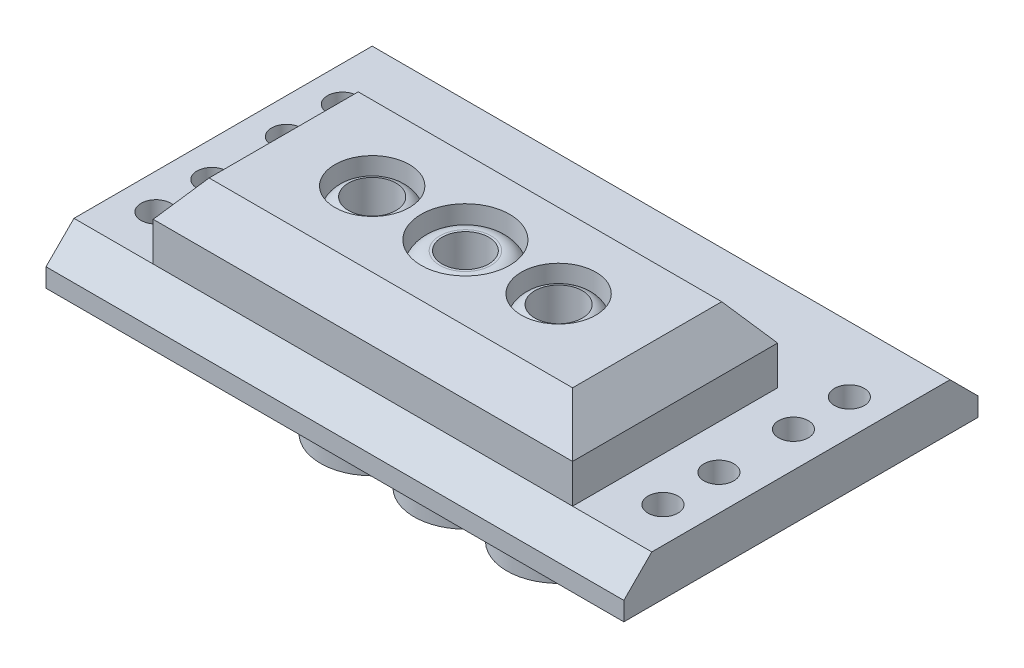
ISO-10303-21;
HEADER;
FILE_DESCRIPTION(('STEP AP214'),'2;1');
FILE_NAME('part.step','',(''),(''),'','','');
FILE_SCHEMA(('AUTOMOTIVE_DESIGN { 1 0 10303 214 1 1 1 1 }'));
ENDSEC;
DATA;
#1=APPLICATION_CONTEXT('core data for automotive mechanical design processes');
#2=APPLICATION_PROTOCOL_DEFINITION('international standard','automotive_design',2000,#1);
#3=PRODUCT_CONTEXT('',#1,'mechanical');
#4=PRODUCT('Part','Part','',(#3));
#5=PRODUCT_RELATED_PRODUCT_CATEGORY('part','',(#4));
#6=PRODUCT_DEFINITION_FORMATION('','',#4);
#7=PRODUCT_DEFINITION_CONTEXT('part definition',#1,'design');
#8=PRODUCT_DEFINITION('design','',#6,#7);
#9=PRODUCT_DEFINITION_SHAPE('','',#8);
#10=(LENGTH_UNIT() NAMED_UNIT(*) SI_UNIT(.MILLI.,.METRE.));
#11=(NAMED_UNIT(*) PLANE_ANGLE_UNIT() SI_UNIT($,.RADIAN.));
#12=(NAMED_UNIT(*) SI_UNIT($,.STERADIAN.) SOLID_ANGLE_UNIT());
#13=UNCERTAINTY_MEASURE_WITH_UNIT(LENGTH_MEASURE(1.E-05),#10,'distance_accuracy_value','');
#14=(GEOMETRIC_REPRESENTATION_CONTEXT(3) GLOBAL_UNCERTAINTY_ASSIGNED_CONTEXT((#13)) GLOBAL_UNIT_ASSIGNED_CONTEXT((#10,
#11,#12)) REPRESENTATION_CONTEXT('',''));
#15=CARTESIAN_POINT('',(0.,0.,0.));
#16=DIRECTION('',(0.,0.,1.));
#17=DIRECTION('',(1.,0.,0.));
#18=AXIS2_PLACEMENT_3D('',#15,#16,#17);
#19=CARTESIAN_POINT('',(22.5,13.,0.));
#20=DIRECTION('',(1.,0.,0.));
#21=DIRECTION('',(0.,0.,-1.));
#22=AXIS2_PLACEMENT_3D('',#19,#20,#21);
#23=PLANE('',#22);
#24=DIRECTION('',(0.,-1.,0.));
#25=VECTOR('',#24,1.);
#26=CARTESIAN_POINT('',(22.5,13.,-6.));
#27=LINE('',#26,#25);
#28=CARTESIAN_POINT('',(22.5,9.16017510342077,-6.));
#29=VERTEX_POINT('',#28);
#30=CARTESIAN_POINT('',(22.5,5.,-6.));
#31=VERTEX_POINT('',#30);
#32=EDGE_CURVE('E99',#29,#31,#27,.T.);
#33=ORIENTED_EDGE('',*,*,#32,.F.);
#34=DIRECTION('',(0.,0.,1.));
#35=VECTOR('',#34,1.);
#36=CARTESIAN_POINT('',(22.5,9.16017510342077,0.));
#37=LINE('',#36,#35);
#38=CARTESIAN_POINT('',(22.5,9.16017510342077,16.));
#39=VERTEX_POINT('',#38);
#40=EDGE_CURVE('E154',#29,#39,#37,.T.);
#41=ORIENTED_EDGE('',*,*,#40,.T.);
#42=DIRECTION('',(0.,-1.,0.));
#43=VECTOR('',#42,1.);
#44=CARTESIAN_POINT('',(22.5,13.,16.));
#45=LINE('',#44,#43);
#46=CARTESIAN_POINT('',(22.5,5.,16.));
#47=VERTEX_POINT('',#46);
#48=EDGE_CURVE('E112',#39,#47,#45,.T.);
#49=ORIENTED_EDGE('',*,*,#48,.T.);
#50=DIRECTION('',(0.,0.,1.));
#51=VECTOR('',#50,1.);
#52=CARTESIAN_POINT('',(22.5,5.,0.));
#53=LINE('',#52,#51);
#54=EDGE_CURVE('E110',#31,#47,#53,.T.);
#55=ORIENTED_EDGE('',*,*,#54,.F.);
#56=EDGE_LOOP('',(#33,#41,#49,#55));
#57=FACE_BOUND('',#56,.T.);
#58=ADVANCED_FACE('F47',(#57),#23,.T.);
#59=CARTESIAN_POINT('',(0.,13.,-6.));
#60=DIRECTION('',(0.,0.,-1.));
#61=DIRECTION('',(-1.,0.,0.));
#62=AXIS2_PLACEMENT_3D('',#59,#60,#61);
#63=PLANE('',#62);
#64=DIRECTION('',(0.,-1.,0.));
#65=VECTOR('',#64,1.);
#66=CARTESIAN_POINT('',(-22.5,13.,-6.));
#67=LINE('',#66,#65);
#68=CARTESIAN_POINT('',(-22.5,9.16017510342077,-6.));
#69=VERTEX_POINT('',#68);
#70=CARTESIAN_POINT('',(-22.5,5.,-6.));
#71=VERTEX_POINT('',#70);
#72=EDGE_CURVE('E107',#69,#71,#67,.T.);
#73=ORIENTED_EDGE('',*,*,#72,.F.);
#74=DIRECTION('',(1.,0.,0.));
#75=VECTOR('',#74,1.);
#76=CARTESIAN_POINT('',(0.,9.16017510342077,-6.));
#77=LINE('',#76,#75);
#78=EDGE_CURVE('E12',#69,#29,#77,.T.);
#79=ORIENTED_EDGE('',*,*,#78,.T.);
#80=ORIENTED_EDGE('',*,*,#32,.T.);
#81=DIRECTION('',(1.,0.,0.));
#82=VECTOR('',#81,1.);
#83=CARTESIAN_POINT('',(0.,5.,-6.));
#84=LINE('',#83,#82);
#85=EDGE_CURVE('E103',#71,#31,#84,.T.);
#86=ORIENTED_EDGE('',*,*,#85,.F.);
#87=EDGE_LOOP('',(#73,#79,#80,#86));
#88=FACE_BOUND('',#87,.T.);
#89=ADVANCED_FACE('F101',(#88),#63,.T.);
#90=CARTESIAN_POINT('',(-22.5,13.,0.));
#91=DIRECTION('',(1.,0.,0.));
#92=DIRECTION('',(0.,0.,-1.));
#93=AXIS2_PLACEMENT_3D('',#90,#91,#92);
#94=PLANE('',#93);
#95=DIRECTION('',(0.,-1.,0.));
#96=VECTOR('',#95,1.);
#97=CARTESIAN_POINT('',(-22.5,13.,16.));
#98=LINE('',#97,#96);
#99=CARTESIAN_POINT('',(-22.5,9.16017510342077,16.));
#100=VERTEX_POINT('',#99);
#101=CARTESIAN_POINT('',(-22.5,5.,16.));
#102=VERTEX_POINT('',#101);
#103=EDGE_CURVE('E139',#100,#102,#98,.T.);
#104=ORIENTED_EDGE('',*,*,#103,.F.);
#105=DIRECTION('',(0.,0.,-1.));
#106=VECTOR('',#105,1.);
#107=CARTESIAN_POINT('',(-22.5,9.16017510342077,-6.));
#108=LINE('',#107,#106);
#109=EDGE_CURVE('E57',#100,#69,#108,.T.);
#110=ORIENTED_EDGE('',*,*,#109,.T.);
#111=ORIENTED_EDGE('',*,*,#72,.T.);
#112=DIRECTION('',(0.,0.,1.));
#113=VECTOR('',#112,1.);
#114=CARTESIAN_POINT('',(-22.5,5.,0.));
#115=LINE('',#114,#113);
#116=EDGE_CURVE('E121',#71,#102,#115,.T.);
#117=ORIENTED_EDGE('',*,*,#116,.T.);
#118=EDGE_LOOP('',(#104,#110,#111,#117));
#119=FACE_BOUND('',#118,.T.);
#120=ADVANCED_FACE('F214',(#119),#94,.F.);
#121=CARTESIAN_POINT('',(0.,13.,5.));
#122=DIRECTION('',(0.,-1.,0.));
#123=DIRECTION('',(0.,0.,-1.));
#124=AXIS2_PLACEMENT_3D('',#121,#122,#123);
#125=CYLINDRICAL_SURFACE('',#124,4.75);
#126=CARTESIAN_POINT('',(0.,13.,5.));
#127=DIRECTION('',(0.,1.,0.));
#128=DIRECTION('',(0.,0.,1.));
#129=AXIS2_PLACEMENT_3D('',#126,#127,#128);
#130=CIRCLE('',#129,4.75);
#131=CARTESIAN_POINT('',(0.,13.,9.75));
#132=VERTEX_POINT('',#131);
#133=EDGE_CURVE('E193',#132,#132,#130,.F.);
#134=ORIENTED_EDGE('',*,*,#133,.F.);
#135=EDGE_LOOP('',(#134));
#136=FACE_BOUND('',#135,.T.);
#137=CARTESIAN_POINT('',(0.,5.,5.));
#138=DIRECTION('',(0.,1.,0.));
#139=DIRECTION('',(0.,0.,1.));
#140=AXIS2_PLACEMENT_3D('',#137,#138,#139);
#141=CIRCLE('',#140,4.75);
#142=CARTESIAN_POINT('',(0.,5.,9.75));
#143=VERTEX_POINT('',#142);
#144=EDGE_CURVE('E131',#143,#143,#141,.F.);
#145=ORIENTED_EDGE('',*,*,#144,.T.);
#146=EDGE_LOOP('',(#145));
#147=FACE_BOUND('',#146,.T.);
#148=ADVANCED_FACE('F283',(#136,#147),#125,.F.);
#149=CARTESIAN_POINT('',(10.,13.,5.));
#150=DIRECTION('',(0.,-1.,0.));
#151=DIRECTION('',(0.,0.,-1.));
#152=AXIS2_PLACEMENT_3D('',#149,#150,#151);
#153=CYLINDRICAL_SURFACE('',#152,4.);
#154=CARTESIAN_POINT('',(10.,13.,5.));
#155=DIRECTION('',(0.,1.,0.));
#156=DIRECTION('',(0.,0.,1.));
#157=AXIS2_PLACEMENT_3D('',#154,#155,#156);
#158=CIRCLE('',#157,4.);
#159=CARTESIAN_POINT('',(10.,13.,9.));
#160=VERTEX_POINT('',#159);
#161=EDGE_CURVE('E137',#160,#160,#158,.F.);
#162=ORIENTED_EDGE('',*,*,#161,.F.);
#163=EDGE_LOOP('',(#162));
#164=FACE_BOUND('',#163,.T.);
#165=CARTESIAN_POINT('',(10.,5.,5.));
#166=DIRECTION('',(0.,1.,0.));
#167=DIRECTION('',(0.,0.,1.));
#168=AXIS2_PLACEMENT_3D('',#165,#166,#167);
#169=CIRCLE('',#168,4.);
#170=CARTESIAN_POINT('',(10.,5.,9.));
#171=VERTEX_POINT('',#170);
#172=EDGE_CURVE('E128',#171,#171,#169,.F.);
#173=ORIENTED_EDGE('',*,*,#172,.T.);
#174=EDGE_LOOP('',(#173));
#175=FACE_BOUND('',#174,.T.);
#176=ADVANCED_FACE('F292',(#164,#175),#153,.F.);
#177=CARTESIAN_POINT('',(0.,13.,16.));
#178=DIRECTION('',(0.,0.,-1.));
#179=DIRECTION('',(-1.,0.,0.));
#180=AXIS2_PLACEMENT_3D('',#177,#178,#179);
#181=PLANE('',#180);
#182=ORIENTED_EDGE('',*,*,#48,.F.);
#183=DIRECTION('',(-1.,0.,0.));
#184=VECTOR('',#183,1.);
#185=CARTESIAN_POINT('',(-22.5,9.16017510342077,16.));
#186=LINE('',#185,#184);
#187=EDGE_CURVE('E151',#39,#100,#186,.T.);
#188=ORIENTED_EDGE('',*,*,#187,.T.);
#189=ORIENTED_EDGE('',*,*,#103,.T.);
#190=DIRECTION('',(1.,0.,0.));
#191=VECTOR('',#190,1.);
#192=CARTESIAN_POINT('',(0.,5.,16.));
#193=LINE('',#192,#191);
#194=EDGE_CURVE('E123',#102,#47,#193,.T.);
#195=ORIENTED_EDGE('',*,*,#194,.T.);
#196=EDGE_LOOP('',(#182,#188,#189,#195));
#197=FACE_BOUND('',#196,.T.);
#198=ADVANCED_FACE('F177',(#197),#181,.F.);
#199=CARTESIAN_POINT('',(-10.,13.,5.));
#200=DIRECTION('',(0.,-1.,0.));
#201=DIRECTION('',(0.,0.,-1.));
#202=AXIS2_PLACEMENT_3D('',#199,#200,#201);
#203=CYLINDRICAL_SURFACE('',#202,4.);
#204=CARTESIAN_POINT('',(-10.,13.,5.));
#205=DIRECTION('',(0.,1.,0.));
#206=DIRECTION('',(0.,0.,1.));
#207=AXIS2_PLACEMENT_3D('',#204,#205,#206);
#208=CIRCLE('',#207,4.);
#209=CARTESIAN_POINT('',(-10.,13.,9.));
#210=VERTEX_POINT('',#209);
#211=EDGE_CURVE('E140',#210,#210,#208,.F.);
#212=ORIENTED_EDGE('',*,*,#211,.F.);
#213=EDGE_LOOP('',(#212));
#214=FACE_BOUND('',#213,.T.);
#215=CARTESIAN_POINT('',(-10.,5.,5.));
#216=DIRECTION('',(0.,1.,0.));
#217=DIRECTION('',(0.,0.,1.));
#218=AXIS2_PLACEMENT_3D('',#215,#216,#217);
#219=CIRCLE('',#218,4.);
#220=CARTESIAN_POINT('',(-10.,5.,9.));
#221=VERTEX_POINT('',#220);
#222=EDGE_CURVE('E134',#221,#221,#219,.F.);
#223=ORIENTED_EDGE('',*,*,#222,.T.);
#224=EDGE_LOOP('',(#223));
#225=FACE_BOUND('',#224,.T.);
#226=ADVANCED_FACE('F185',(#214,#225),#203,.F.);
#227=CARTESIAN_POINT('',(0.,13.,0.));
#228=DIRECTION('',(0.,1.,0.));
#229=DIRECTION('',(0.,0.,1.));
#230=AXIS2_PLACEMENT_3D('',#227,#228,#229);
#231=PLANE('',#230);
#232=DIRECTION('',(0.,0.,1.));
#233=VECTOR('',#232,1.);
#234=CARTESIAN_POINT('',(-19.5,13.,16.));
#235=LINE('',#234,#233);
#236=CARTESIAN_POINT('',(-19.5,13.,-3.));
#237=VERTEX_POINT('',#236);
#238=CARTESIAN_POINT('',(-19.5,13.,13.));
#239=VERTEX_POINT('',#238);
#240=EDGE_CURVE('E144',#237,#239,#235,.T.);
#241=ORIENTED_EDGE('',*,*,#240,.T.);
#242=DIRECTION('',(1.,0.,0.));
#243=VECTOR('',#242,1.);
#244=CARTESIAN_POINT('',(22.5,13.,13.));
#245=LINE('',#244,#243);
#246=CARTESIAN_POINT('',(19.5,13.,13.));
#247=VERTEX_POINT('',#246);
#248=EDGE_CURVE('E148',#239,#247,#245,.T.);
#249=ORIENTED_EDGE('',*,*,#248,.T.);
#250=DIRECTION('',(0.,0.,-1.));
#251=VECTOR('',#250,1.);
#252=CARTESIAN_POINT('',(19.5,13.,0.));
#253=LINE('',#252,#251);
#254=CARTESIAN_POINT('',(19.5,13.,-3.));
#255=VERTEX_POINT('',#254);
#256=EDGE_CURVE('E146',#247,#255,#253,.T.);
#257=ORIENTED_EDGE('',*,*,#256,.T.);
#258=DIRECTION('',(-1.,0.,0.));
#259=VECTOR('',#258,1.);
#260=CARTESIAN_POINT('',(0.,13.,-3.));
#261=LINE('',#260,#259);
#262=EDGE_CURVE('E106',#255,#237,#261,.T.);
#263=ORIENTED_EDGE('',*,*,#262,.T.);
#264=EDGE_LOOP('',(#241,#249,#257,#263));
#265=FACE_BOUND('',#264,.T.);
#266=ORIENTED_EDGE('',*,*,#161,.T.);
#267=EDGE_LOOP('',(#266));
#268=FACE_BOUND('',#267,.T.);
#269=ORIENTED_EDGE('',*,*,#133,.T.);
#270=EDGE_LOOP('',(#269));
#271=FACE_BOUND('',#270,.T.);
#272=ORIENTED_EDGE('',*,*,#211,.T.);
#273=EDGE_LOOP('',(#272));
#274=FACE_BOUND('',#273,.T.);
#275=ADVANCED_FACE('F182',(#265,#268,#271,#274),#231,.T.);
#276=CARTESIAN_POINT('',(0.,5.,0.));
#277=DIRECTION('',(0.,1.,0.));
#278=DIRECTION('',(0.,0.,1.));
#279=AXIS2_PLACEMENT_3D('',#276,#277,#278);
#280=PLANE('',#279);
#281=ORIENTED_EDGE('',*,*,#54,.T.);
#282=ORIENTED_EDGE('',*,*,#194,.F.);
#283=ORIENTED_EDGE('',*,*,#116,.F.);
#284=ORIENTED_EDGE('',*,*,#85,.T.);
#285=EDGE_LOOP('',(#281,#282,#283,#284));
#286=FACE_BOUND('',#285,.T.);
#287=ORIENTED_EDGE('',*,*,#172,.F.);
#288=EDGE_LOOP('',(#287));
#289=FACE_BOUND('',#288,.T.);
#290=ORIENTED_EDGE('',*,*,#144,.F.);
#291=EDGE_LOOP('',(#290));
#292=FACE_BOUND('',#291,.T.);
#293=ORIENTED_EDGE('',*,*,#222,.F.);
#294=EDGE_LOOP('',(#293));
#295=FACE_BOUND('',#294,.T.);
#296=ADVANCED_FACE('F118',(#286,#289,#292,#295),#280,.F.);
#297=CARTESIAN_POINT('',(0.,9.16017510342077,-6.));
#298=DIRECTION('',(0.,-0.615661475325659,0.788010753606721));
#299=DIRECTION('',(1.,0.,0.));
#300=AXIS2_PLACEMENT_3D('',#297,#298,#299);
#301=PLANE('',#300);
#302=DIRECTION('',(0.524268417664047,-0.671032974212201,-0.524268417664047));
#303=VECTOR('',#302,1.);
#304=CARTESIAN_POINT('',(16.3157090904008,17.0757065042099,0.184290909599182));
#305=LINE('',#304,#303);
#306=EDGE_CURVE('E160',#29,#255,#305,.F.);
#307=ORIENTED_EDGE('',*,*,#306,.F.);
#308=ORIENTED_EDGE('',*,*,#78,.F.);
#309=DIRECTION('',(-0.524268417664047,-0.671032974212201,-0.524268417664047));
#310=VECTOR('',#309,1.);
#311=CARTESIAN_POINT('',(-16.3157090904008,17.0757065042099,0.18429090959918));
#312=LINE('',#311,#310);
#313=EDGE_CURVE('E52',#237,#69,#312,.T.);
#314=ORIENTED_EDGE('',*,*,#313,.F.);
#315=ORIENTED_EDGE('',*,*,#262,.F.);
#316=EDGE_LOOP('',(#307,#308,#314,#315));
#317=FACE_BOUND('',#316,.T.);
#318=ADVANCED_FACE('F50',(#317),#301,.F.);
#319=CARTESIAN_POINT('',(-19.5,13.,0.));
#320=DIRECTION('',(-0.788010753606721,0.615661475325659,0.));
#321=DIRECTION('',(0.,0.,-1.));
#322=AXIS2_PLACEMENT_3D('',#319,#320,#321);
#323=PLANE('',#322);
#324=ORIENTED_EDGE('',*,*,#313,.T.);
#325=ORIENTED_EDGE('',*,*,#109,.F.);
#326=DIRECTION('',(0.524268417664047,0.671032974212201,-0.524268417664047));
#327=VECTOR('',#326,1.);
#328=CARTESIAN_POINT('',(-15.9268541411205,17.5734181426782,9.42685414112047));
#329=LINE('',#328,#327);
#330=EDGE_CURVE('E159',#239,#100,#329,.F.);
#331=ORIENTED_EDGE('',*,*,#330,.F.);
#332=ORIENTED_EDGE('',*,*,#240,.F.);
#333=EDGE_LOOP('',(#324,#325,#331,#332));
#334=FACE_BOUND('',#333,.T.);
#335=ADVANCED_FACE('F169',(#334),#323,.T.);
#336=CARTESIAN_POINT('',(22.5,9.16017510342077,0.));
#337=DIRECTION('',(-0.788010753606721,-0.615661475325659,0.));
#338=DIRECTION('',(0.,0.,1.));
#339=AXIS2_PLACEMENT_3D('',#336,#337,#338);
#340=PLANE('',#339);
#341=ORIENTED_EDGE('',*,*,#306,.T.);
#342=ORIENTED_EDGE('',*,*,#256,.F.);
#343=DIRECTION('',(-0.524268417664047,0.671032974212201,-0.524268417664047));
#344=VECTOR('',#343,1.);
#345=CARTESIAN_POINT('',(18.1022820198406,14.7889974328708,11.6022820198406));
#346=LINE('',#345,#344);
#347=EDGE_CURVE('E157',#39,#247,#346,.T.);
#348=ORIENTED_EDGE('',*,*,#347,.F.);
#349=ORIENTED_EDGE('',*,*,#40,.F.);
#350=EDGE_LOOP('',(#341,#342,#348,#349));
#351=FACE_BOUND('',#350,.T.);
#352=ADVANCED_FACE('F174',(#351),#340,.F.);
#353=CARTESIAN_POINT('',(0.,13.,13.));
#354=DIRECTION('',(0.,0.615661475325659,0.788010753606721));
#355=DIRECTION('',(-1.,0.,0.));
#356=AXIS2_PLACEMENT_3D('',#353,#354,#355);
#357=PLANE('',#356);
#358=ORIENTED_EDGE('',*,*,#330,.T.);
#359=ORIENTED_EDGE('',*,*,#187,.F.);
#360=ORIENTED_EDGE('',*,*,#347,.T.);
#361=ORIENTED_EDGE('',*,*,#248,.F.);
#362=EDGE_LOOP('',(#358,#359,#360,#361));
#363=FACE_BOUND('',#362,.T.);
#364=ADVANCED_FACE('F179',(#363),#357,.T.);
#365=CLOSED_SHELL('',(#58,#89,#120,#148,#176,#198,#226,#275,#296,#318,#335,#352,#364));
#366=MANIFOLD_SOLID_BREP('B2',#365);
#367=CARTESIAN_POINT('',(0.,5.,0.));
#368=DIRECTION('',(0.,-1.,0.));
#369=DIRECTION('',(0.,0.,-1.));
#370=AXIS2_PLACEMENT_3D('',#367,#368,#369);
#371=PLANE('',#370);
#372=CARTESIAN_POINT('',(-10.,5.,5.));
#373=DIRECTION('',(0.,-1.,0.));
#374=DIRECTION('',(0.,0.,-1.));
#375=AXIS2_PLACEMENT_3D('',#372,#373,#374);
#376=CIRCLE('',#375,4.);
#377=CARTESIAN_POINT('',(-10.,5.,1.));
#378=VERTEX_POINT('',#377);
#379=EDGE_CURVE('E557',#378,#378,#376,.F.);
#380=ORIENTED_EDGE('',*,*,#379,.F.);
#381=EDGE_LOOP('',(#380));
#382=FACE_BOUND('',#381,.T.);
#383=CARTESIAN_POINT('',(-27.2,5.,-9.));
#384=DIRECTION('',(0.,1.,0.));
#385=DIRECTION('',(0.,0.,1.));
#386=AXIS2_PLACEMENT_3D('',#383,#384,#385);
#387=CIRCLE('',#386,1.6);
#388=CARTESIAN_POINT('',(-27.2,5.,-7.4));
#389=VERTEX_POINT('',#388);
#390=EDGE_CURVE('E475',#389,#389,#387,.T.);
#391=ORIENTED_EDGE('',*,*,#390,.F.);
#392=EDGE_LOOP('',(#391));
#393=FACE_BOUND('',#392,.T.);
#394=CARTESIAN_POINT('',(-27.2,5.,-3.));
#395=DIRECTION('',(0.,1.,0.));
#396=DIRECTION('',(0.,0.,1.));
#397=AXIS2_PLACEMENT_3D('',#394,#395,#396);
#398=CIRCLE('',#397,1.6);
#399=CARTESIAN_POINT('',(-27.2,5.,-1.4));
#400=VERTEX_POINT('',#399);
#401=EDGE_CURVE('E481',#400,#400,#398,.T.);
#402=ORIENTED_EDGE('',*,*,#401,.F.);
#403=EDGE_LOOP('',(#402));
#404=FACE_BOUND('',#403,.T.);
#405=CARTESIAN_POINT('',(27.2,5.,-3.));
#406=DIRECTION('',(0.,1.,0.));
#407=DIRECTION('',(0.,0.,1.));
#408=AXIS2_PLACEMENT_3D('',#405,#406,#407);
#409=CIRCLE('',#408,1.6);
#410=CARTESIAN_POINT('',(27.2,5.,-1.4));
#411=VERTEX_POINT('',#410);
#412=EDGE_CURVE('E487',#411,#411,#409,.T.);
#413=ORIENTED_EDGE('',*,*,#412,.F.);
#414=EDGE_LOOP('',(#413));
#415=FACE_BOUND('',#414,.T.);
#416=CARTESIAN_POINT('',(27.2,5.,-9.));
#417=DIRECTION('',(0.,1.,0.));
#418=DIRECTION('',(0.,0.,1.));
#419=AXIS2_PLACEMENT_3D('',#416,#417,#418);
#420=CIRCLE('',#419,1.6);
#421=CARTESIAN_POINT('',(27.2,5.,-7.4));
#422=VERTEX_POINT('',#421);
#423=EDGE_CURVE('E493',#422,#422,#420,.T.);
#424=ORIENTED_EDGE('',*,*,#423,.F.);
#425=EDGE_LOOP('',(#424));
#426=FACE_BOUND('',#425,.T.);
#427=CARTESIAN_POINT('',(-27.2,5.,5.00000000000001));
#428=DIRECTION('',(0.,1.,0.));
#429=DIRECTION('',(0.,0.,1.));
#430=AXIS2_PLACEMENT_3D('',#427,#428,#429);
#431=CIRCLE('',#430,1.6);
#432=CARTESIAN_POINT('',(-27.2,5.,6.60000000000001));
#433=VERTEX_POINT('',#432);
#434=EDGE_CURVE('E499',#433,#433,#431,.T.);
#435=ORIENTED_EDGE('',*,*,#434,.F.);
#436=EDGE_LOOP('',(#435));
#437=FACE_BOUND('',#436,.T.);
#438=CARTESIAN_POINT('',(-27.2,5.,11.));
#439=DIRECTION('',(0.,1.,0.));
#440=DIRECTION('',(0.,0.,1.));
#441=AXIS2_PLACEMENT_3D('',#438,#439,#440);
#442=CIRCLE('',#441,1.6);
#443=CARTESIAN_POINT('',(-27.2,5.,12.6));
#444=VERTEX_POINT('',#443);
#445=EDGE_CURVE('E505',#444,#444,#442,.T.);
#446=ORIENTED_EDGE('',*,*,#445,.F.);
#447=EDGE_LOOP('',(#446));
#448=FACE_BOUND('',#447,.T.);
#449=CARTESIAN_POINT('',(27.2,5.,5.));
#450=DIRECTION('',(0.,1.,0.));
#451=DIRECTION('',(0.,0.,1.));
#452=AXIS2_PLACEMENT_3D('',#449,#450,#451);
#453=CIRCLE('',#452,1.60000000000001);
#454=CARTESIAN_POINT('',(27.2,5.,6.6));
#455=VERTEX_POINT('',#454);
#456=EDGE_CURVE('E511',#455,#455,#453,.T.);
#457=ORIENTED_EDGE('',*,*,#456,.F.);
#458=EDGE_LOOP('',(#457));
#459=FACE_BOUND('',#458,.T.);
#460=CARTESIAN_POINT('',(27.2,5.,11.));
#461=DIRECTION('',(0.,1.,0.));
#462=DIRECTION('',(0.,0.,1.));
#463=AXIS2_PLACEMENT_3D('',#460,#461,#462);
#464=CIRCLE('',#463,1.6);
#465=CARTESIAN_POINT('',(27.2,5.,12.6));
#466=VERTEX_POINT('',#465);
#467=EDGE_CURVE('E517',#466,#466,#464,.T.);
#468=ORIENTED_EDGE('',*,*,#467,.F.);
#469=EDGE_LOOP('',(#468));
#470=FACE_BOUND('',#469,.T.);
#471=DIRECTION('',(0.,0.,-1.));
#472=VECTOR('',#471,1.);
#473=CARTESIAN_POINT('',(31.,5.,19.));
#474=LINE('',#473,#472);
#475=CARTESIAN_POINT('',(31.,5.,16.));
#476=VERTEX_POINT('',#475);
#477=CARTESIAN_POINT('',(31.,5.,-16.));
#478=VERTEX_POINT('',#477);
#479=EDGE_CURVE('E523',#476,#478,#474,.T.);
#480=ORIENTED_EDGE('',*,*,#479,.T.);
#481=DIRECTION('',(-1.,0.,0.));
#482=VECTOR('',#481,1.);
#483=CARTESIAN_POINT('',(0.,5.,-16.));
#484=LINE('',#483,#482);
#485=CARTESIAN_POINT('',(-31.,5.,-16.));
#486=VERTEX_POINT('',#485);
#487=EDGE_CURVE('E572',#478,#486,#484,.T.);
#488=ORIENTED_EDGE('',*,*,#487,.T.);
#489=DIRECTION('',(0.,0.,1.));
#490=VECTOR('',#489,1.);
#491=CARTESIAN_POINT('',(-31.,5.,19.));
#492=LINE('',#491,#490);
#493=CARTESIAN_POINT('',(-31.,5.,16.));
#494=VERTEX_POINT('',#493);
#495=EDGE_CURVE('E526',#486,#494,#492,.T.);
#496=ORIENTED_EDGE('',*,*,#495,.T.);
#497=DIRECTION('',(1.,0.,0.));
#498=VECTOR('',#497,1.);
#499=CARTESIAN_POINT('',(0.,5.,16.));
#500=LINE('',#499,#498);
#501=EDGE_CURVE('E569',#494,#476,#500,.T.);
#502=ORIENTED_EDGE('',*,*,#501,.T.);
#503=EDGE_LOOP('',(#480,#488,#496,#502));
#504=FACE_BOUND('',#503,.T.);
#505=CARTESIAN_POINT('',(0.,5.,5.));
#506=DIRECTION('',(0.,-1.,0.));
#507=DIRECTION('',(0.,0.,-1.));
#508=AXIS2_PLACEMENT_3D('',#505,#506,#507);
#509=CIRCLE('',#508,4.75);
#510=CARTESIAN_POINT('',(0.,5.,0.249999999999999));
#511=VERTEX_POINT('',#510);
#512=EDGE_CURVE('E548',#511,#511,#509,.F.);
#513=ORIENTED_EDGE('',*,*,#512,.F.);
#514=EDGE_LOOP('',(#513));
#515=FACE_BOUND('',#514,.T.);
#516=CARTESIAN_POINT('',(10.,5.,5.));
#517=DIRECTION('',(0.,-1.,0.));
#518=DIRECTION('',(0.,0.,-1.));
#519=AXIS2_PLACEMENT_3D('',#516,#517,#518);
#520=CIRCLE('',#519,4.);
#521=CARTESIAN_POINT('',(10.,5.,0.999999999999998));
#522=VERTEX_POINT('',#521);
#523=EDGE_CURVE('E560',#522,#522,#520,.F.);
#524=ORIENTED_EDGE('',*,*,#523,.F.);
#525=EDGE_LOOP('',(#524));
#526=FACE_BOUND('',#525,.T.);
#527=ADVANCED_FACE('F341',(#382,#393,#404,#415,#426,#437,#448,#459,#470,#504,#515,#526),#371,.F.);
#528=CARTESIAN_POINT('',(0.,0.,0.));
#529=DIRECTION('',(0.,-1.,0.));
#530=DIRECTION('',(0.,0.,-1.));
#531=AXIS2_PLACEMENT_3D('',#528,#529,#530);
#532=PLANE('',#531);
#533=CARTESIAN_POINT('',(-10.,0.,5.));
#534=DIRECTION('',(0.,-1.,0.));
#535=DIRECTION('',(0.,0.,-1.));
#536=AXIS2_PLACEMENT_3D('',#533,#534,#535);
#537=CIRCLE('',#536,5.55);
#538=CARTESIAN_POINT('',(-4.972375,0.,2.64936458391033));
#539=VERTEX_POINT('',#538);
#540=CARTESIAN_POINT('',(-4.972375,0.,7.35063541608967));
#541=VERTEX_POINT('',#540);
#542=EDGE_CURVE('E426',#539,#541,#537,.F.);
#543=ORIENTED_EDGE('',*,*,#542,.T.);
#544=CARTESIAN_POINT('',(0.,0.,5.));
#545=DIRECTION('',(0.,-1.,0.));
#546=DIRECTION('',(0.,0.,-1.));
#547=AXIS2_PLACEMENT_3D('',#544,#545,#546);
#548=CIRCLE('',#547,5.5);
#549=CARTESIAN_POINT('',(4.972375,0.,7.35063541608966));
#550=VERTEX_POINT('',#549);
#551=EDGE_CURVE('E444',#550,#541,#548,.T.);
#552=ORIENTED_EDGE('',*,*,#551,.F.);
#553=CARTESIAN_POINT('',(10.,0.,5.));
#554=DIRECTION('',(0.,-1.,0.));
#555=DIRECTION('',(0.,0.,-1.));
#556=AXIS2_PLACEMENT_3D('',#553,#554,#555);
#557=CIRCLE('',#556,5.55);
#558=CARTESIAN_POINT('',(4.972375,0.,2.64936458391034));
#559=VERTEX_POINT('',#558);
#560=EDGE_CURVE('E446',#559,#550,#557,.T.);
#561=ORIENTED_EDGE('',*,*,#560,.F.);
#562=EDGE_CURVE('E448',#539,#559,#548,.T.);
#563=ORIENTED_EDGE('',*,*,#562,.F.);
#564=EDGE_LOOP('',(#543,#552,#561,#563));
#565=FACE_BOUND('',#564,.T.);
#566=CARTESIAN_POINT('',(-27.2,0.,-9.));
#567=DIRECTION('',(0.,1.,0.));
#568=DIRECTION('',(0.,0.,1.));
#569=AXIS2_PLACEMENT_3D('',#566,#567,#568);
#570=CIRCLE('',#569,1.6);
#571=CARTESIAN_POINT('',(-27.2,0.,-7.4));
#572=VERTEX_POINT('',#571);
#573=EDGE_CURVE('E474',#572,#572,#570,.T.);
#574=ORIENTED_EDGE('',*,*,#573,.T.);
#575=EDGE_LOOP('',(#574));
#576=FACE_BOUND('',#575,.T.);
#577=CARTESIAN_POINT('',(27.2,0.,-3.));
#578=DIRECTION('',(0.,1.,0.));
#579=DIRECTION('',(0.,0.,1.));
#580=AXIS2_PLACEMENT_3D('',#577,#578,#579);
#581=CIRCLE('',#580,1.6);
#582=CARTESIAN_POINT('',(27.2,0.,-1.4));
#583=VERTEX_POINT('',#582);
#584=EDGE_CURVE('E484',#583,#583,#581,.T.);
#585=ORIENTED_EDGE('',*,*,#584,.T.);
#586=EDGE_LOOP('',(#585));
#587=FACE_BOUND('',#586,.T.);
#588=CARTESIAN_POINT('',(-27.2,0.,5.00000000000001));
#589=DIRECTION('',(0.,1.,0.));
#590=DIRECTION('',(0.,0.,1.));
#591=AXIS2_PLACEMENT_3D('',#588,#589,#590);
#592=CIRCLE('',#591,1.6);
#593=CARTESIAN_POINT('',(-27.2,0.,6.60000000000001));
#594=VERTEX_POINT('',#593);
#595=EDGE_CURVE('E496',#594,#594,#592,.T.);
#596=ORIENTED_EDGE('',*,*,#595,.T.);
#597=EDGE_LOOP('',(#596));
#598=FACE_BOUND('',#597,.T.);
#599=CARTESIAN_POINT('',(27.2,0.,5.));
#600=DIRECTION('',(0.,1.,0.));
#601=DIRECTION('',(0.,0.,1.));
#602=AXIS2_PLACEMENT_3D('',#599,#600,#601);
#603=CIRCLE('',#602,1.60000000000001);
#604=CARTESIAN_POINT('',(27.2,0.,6.6));
#605=VERTEX_POINT('',#604);
#606=EDGE_CURVE('E508',#605,#605,#603,.T.);
#607=ORIENTED_EDGE('',*,*,#606,.T.);
#608=EDGE_LOOP('',(#607));
#609=FACE_BOUND('',#608,.T.);
#610=DIRECTION('',(0.,0.,-1.));
#611=VECTOR('',#610,1.);
#612=CARTESIAN_POINT('',(31.,0.,19.));
#613=LINE('',#612,#611);
#614=CARTESIAN_POINT('',(31.,0.,19.));
#615=VERTEX_POINT('',#614);
#616=CARTESIAN_POINT('',(31.,0.,-19.));
#617=VERTEX_POINT('',#616);
#618=EDGE_CURVE('E520',#615,#617,#613,.T.);
#619=ORIENTED_EDGE('',*,*,#618,.F.);
#620=DIRECTION('',(1.,0.,0.));
#621=VECTOR('',#620,1.);
#622=CARTESIAN_POINT('',(-31.,0.,19.));
#623=LINE('',#622,#621);
#624=CARTESIAN_POINT('',(-31.,0.,19.));
#625=VERTEX_POINT('',#624);
#626=EDGE_CURVE('E527',#625,#615,#623,.T.);
#627=ORIENTED_EDGE('',*,*,#626,.F.);
#628=DIRECTION('',(0.,0.,1.));
#629=VECTOR('',#628,1.);
#630=CARTESIAN_POINT('',(-31.,0.,19.));
#631=LINE('',#630,#629);
#632=CARTESIAN_POINT('',(-31.,0.,-19.));
#633=VERTEX_POINT('',#632);
#634=EDGE_CURVE('E536',#633,#625,#631,.T.);
#635=ORIENTED_EDGE('',*,*,#634,.F.);
#636=DIRECTION('',(-1.,0.,0.));
#637=VECTOR('',#636,1.);
#638=CARTESIAN_POINT('',(-31.,0.,-19.));
#639=LINE('',#638,#637);
#640=EDGE_CURVE('E533',#617,#633,#639,.T.);
#641=ORIENTED_EDGE('',*,*,#640,.F.);
#642=EDGE_LOOP('',(#619,#627,#635,#641));
#643=FACE_BOUND('',#642,.T.);
#644=CARTESIAN_POINT('',(27.2,0.,11.));
#645=DIRECTION('',(0.,1.,0.));
#646=DIRECTION('',(0.,0.,1.));
#647=AXIS2_PLACEMENT_3D('',#644,#645,#646);
#648=CIRCLE('',#647,1.6);
#649=CARTESIAN_POINT('',(27.2,0.,12.6));
#650=VERTEX_POINT('',#649);
#651=EDGE_CURVE('E514',#650,#650,#648,.T.);
#652=ORIENTED_EDGE('',*,*,#651,.T.);
#653=EDGE_LOOP('',(#652));
#654=FACE_BOUND('',#653,.T.);
#655=CARTESIAN_POINT('',(-27.2,0.,11.));
#656=DIRECTION('',(0.,1.,0.));
#657=DIRECTION('',(0.,0.,1.));
#658=AXIS2_PLACEMENT_3D('',#655,#656,#657);
#659=CIRCLE('',#658,1.6);
#660=CARTESIAN_POINT('',(-27.2,0.,12.6));
#661=VERTEX_POINT('',#660);
#662=EDGE_CURVE('E502',#661,#661,#659,.T.);
#663=ORIENTED_EDGE('',*,*,#662,.T.);
#664=EDGE_LOOP('',(#663));
#665=FACE_BOUND('',#664,.T.);
#666=CARTESIAN_POINT('',(27.2,0.,-9.));
#667=DIRECTION('',(0.,1.,0.));
#668=DIRECTION('',(0.,0.,1.));
#669=AXIS2_PLACEMENT_3D('',#666,#667,#668);
#670=CIRCLE('',#669,1.6);
#671=CARTESIAN_POINT('',(27.2,0.,-7.4));
#672=VERTEX_POINT('',#671);
#673=EDGE_CURVE('E490',#672,#672,#670,.T.);
#674=ORIENTED_EDGE('',*,*,#673,.T.);
#675=EDGE_LOOP('',(#674));
#676=FACE_BOUND('',#675,.T.);
#677=CARTESIAN_POINT('',(-27.2,0.,-3.));
#678=DIRECTION('',(0.,1.,0.));
#679=DIRECTION('',(0.,0.,1.));
#680=AXIS2_PLACEMENT_3D('',#677,#678,#679);
#681=CIRCLE('',#680,1.6);
#682=CARTESIAN_POINT('',(-27.2,0.,-1.4));
#683=VERTEX_POINT('',#682);
#684=EDGE_CURVE('E478',#683,#683,#681,.T.);
#685=ORIENTED_EDGE('',*,*,#684,.T.);
#686=EDGE_LOOP('',(#685));
#687=FACE_BOUND('',#686,.T.);
#688=ADVANCED_FACE('F602',(#565,#576,#587,#598,#609,#643,#654,#665,#676,#687),#532,.T.);
#689=CARTESIAN_POINT('',(31.,5.,19.));
#690=DIRECTION('',(-1.,0.,0.));
#691=DIRECTION('',(0.,0.,1.));
#692=AXIS2_PLACEMENT_3D('',#689,#690,#691);
#693=PLANE('',#692);
#694=DIRECTION('',(0.,-1.,0.));
#695=VECTOR('',#694,1.);
#696=CARTESIAN_POINT('',(31.,5.,-19.));
#697=LINE('',#696,#695);
#698=CARTESIAN_POINT('',(31.,1.99999999999999,-19.));
#699=VERTEX_POINT('',#698);
#700=EDGE_CURVE('E546',#699,#617,#697,.T.);
#701=ORIENTED_EDGE('',*,*,#700,.F.);
#702=DIRECTION('',(0.,-0.707106781186548,-0.707106781186547));
#703=VECTOR('',#702,1.);
#704=CARTESIAN_POINT('',(31.,5.,-16.));
#705=LINE('',#704,#703);
#706=EDGE_CURVE('E350',#699,#478,#705,.F.);
#707=ORIENTED_EDGE('',*,*,#706,.T.);
#708=ORIENTED_EDGE('',*,*,#479,.F.);
#709=DIRECTION('',(0.,0.707106781186548,-0.707106781186547));
#710=VECTOR('',#709,1.);
#711=CARTESIAN_POINT('',(31.,5.,16.));
#712=LINE('',#711,#710);
#713=CARTESIAN_POINT('',(31.,1.99999999999999,19.));
#714=VERTEX_POINT('',#713);
#715=EDGE_CURVE('E365',#476,#714,#712,.F.);
#716=ORIENTED_EDGE('',*,*,#715,.T.);
#717=DIRECTION('',(0.,-1.,0.));
#718=VECTOR('',#717,1.);
#719=CARTESIAN_POINT('',(31.,5.,19.));
#720=LINE('',#719,#718);
#721=EDGE_CURVE('E530',#714,#615,#720,.T.);
#722=ORIENTED_EDGE('',*,*,#721,.T.);
#723=ORIENTED_EDGE('',*,*,#618,.T.);
#724=EDGE_LOOP('',(#701,#707,#708,#716,#722,#723));
#725=FACE_BOUND('',#724,.T.);
#726=ADVANCED_FACE('F583',(#725),#693,.F.);
#727=CARTESIAN_POINT('',(-31.,5.,-19.));
#728=DIRECTION('',(0.,0.,1.));
#729=DIRECTION('',(1.,0.,0.));
#730=AXIS2_PLACEMENT_3D('',#727,#728,#729);
#731=PLANE('',#730);
#732=DIRECTION('',(0.,-1.,0.));
#733=VECTOR('',#732,1.);
#734=CARTESIAN_POINT('',(-31.,5.,-19.));
#735=LINE('',#734,#733);
#736=CARTESIAN_POINT('',(-31.,1.99999999999999,-19.));
#737=VERTEX_POINT('',#736);
#738=EDGE_CURVE('E544',#737,#633,#735,.T.);
#739=ORIENTED_EDGE('',*,*,#738,.F.);
#740=DIRECTION('',(1.,0.,0.));
#741=VECTOR('',#740,1.);
#742=CARTESIAN_POINT('',(-31.,1.99999999999999,-19.));
#743=LINE('',#742,#741);
#744=EDGE_CURVE('E579',#737,#699,#743,.T.);
#745=ORIENTED_EDGE('',*,*,#744,.T.);
#746=ORIENTED_EDGE('',*,*,#700,.T.);
#747=ORIENTED_EDGE('',*,*,#640,.T.);
#748=EDGE_LOOP('',(#739,#745,#746,#747));
#749=FACE_BOUND('',#748,.T.);
#750=ADVANCED_FACE('F596',(#749),#731,.F.);
#751=CARTESIAN_POINT('',(-31.,5.,19.));
#752=DIRECTION('',(1.,0.,0.));
#753=DIRECTION('',(0.,0.,-1.));
#754=AXIS2_PLACEMENT_3D('',#751,#752,#753);
#755=PLANE('',#754);
#756=ORIENTED_EDGE('',*,*,#495,.F.);
#757=DIRECTION('',(0.,0.707106781186548,0.707106781186547));
#758=VECTOR('',#757,1.);
#759=CARTESIAN_POINT('',(-31.,5.,-16.));
#760=LINE('',#759,#758);
#761=EDGE_CURVE('E577',#486,#737,#760,.F.);
#762=ORIENTED_EDGE('',*,*,#761,.T.);
#763=ORIENTED_EDGE('',*,*,#738,.T.);
#764=ORIENTED_EDGE('',*,*,#634,.T.);
#765=DIRECTION('',(0.,-1.,0.));
#766=VECTOR('',#765,1.);
#767=CARTESIAN_POINT('',(-31.,5.,19.));
#768=LINE('',#767,#766);
#769=CARTESIAN_POINT('',(-31.,1.99999999999999,19.));
#770=VERTEX_POINT('',#769);
#771=EDGE_CURVE('E542',#770,#625,#768,.T.);
#772=ORIENTED_EDGE('',*,*,#771,.F.);
#773=DIRECTION('',(0.,-0.707106781186548,0.707106781186547));
#774=VECTOR('',#773,1.);
#775=CARTESIAN_POINT('',(-31.,5.,16.));
#776=LINE('',#775,#774);
#777=EDGE_CURVE('E575',#770,#494,#776,.F.);
#778=ORIENTED_EDGE('',*,*,#777,.T.);
#779=EDGE_LOOP('',(#756,#762,#763,#764,#772,#778));
#780=FACE_BOUND('',#779,.T.);
#781=ADVANCED_FACE('F594',(#780),#755,.F.);
#782=CARTESIAN_POINT('',(-31.,5.,19.));
#783=DIRECTION('',(0.,0.,-1.));
#784=DIRECTION('',(-1.,0.,0.));
#785=AXIS2_PLACEMENT_3D('',#782,#783,#784);
#786=PLANE('',#785);
#787=ORIENTED_EDGE('',*,*,#721,.F.);
#788=DIRECTION('',(-1.,0.,0.));
#789=VECTOR('',#788,1.);
#790=CARTESIAN_POINT('',(-31.,1.99999999999999,19.));
#791=LINE('',#790,#789);
#792=EDGE_CURVE('E45',#714,#770,#791,.T.);
#793=ORIENTED_EDGE('',*,*,#792,.T.);
#794=ORIENTED_EDGE('',*,*,#771,.T.);
#795=ORIENTED_EDGE('',*,*,#626,.T.);
#796=EDGE_LOOP('',(#787,#793,#794,#795));
#797=FACE_BOUND('',#796,.T.);
#798=ADVANCED_FACE('F609',(#797),#786,.F.);
#799=CARTESIAN_POINT('',(27.2,5.,11.));
#800=DIRECTION('',(0.,-1.,0.));
#801=DIRECTION('',(0.,0.,-1.));
#802=AXIS2_PLACEMENT_3D('',#799,#800,#801);
#803=CYLINDRICAL_SURFACE('',#802,1.6);
#804=ORIENTED_EDGE('',*,*,#467,.T.);
#805=EDGE_LOOP('',(#804));
#806=FACE_BOUND('',#805,.T.);
#807=ORIENTED_EDGE('',*,*,#651,.F.);
#808=EDGE_LOOP('',(#807));
#809=FACE_BOUND('',#808,.T.);
#810=ADVANCED_FACE('F611',(#806,#809),#803,.F.);
#811=CARTESIAN_POINT('',(27.2,5.,5.));
#812=DIRECTION('',(0.,-1.,0.));
#813=DIRECTION('',(0.,0.,-1.));
#814=AXIS2_PLACEMENT_3D('',#811,#812,#813);
#815=CYLINDRICAL_SURFACE('',#814,1.60000000000001);
#816=ORIENTED_EDGE('',*,*,#456,.T.);
#817=EDGE_LOOP('',(#816));
#818=FACE_BOUND('',#817,.T.);
#819=ORIENTED_EDGE('',*,*,#606,.F.);
#820=EDGE_LOOP('',(#819));
#821=FACE_BOUND('',#820,.T.);
#822=ADVANCED_FACE('F617',(#818,#821),#815,.F.);
#823=CARTESIAN_POINT('',(-27.2,5.,11.));
#824=DIRECTION('',(0.,-1.,0.));
#825=DIRECTION('',(0.,0.,-1.));
#826=AXIS2_PLACEMENT_3D('',#823,#824,#825);
#827=CYLINDRICAL_SURFACE('',#826,1.6);
#828=ORIENTED_EDGE('',*,*,#445,.T.);
#829=EDGE_LOOP('',(#828));
#830=FACE_BOUND('',#829,.T.);
#831=ORIENTED_EDGE('',*,*,#662,.F.);
#832=EDGE_LOOP('',(#831));
#833=FACE_BOUND('',#832,.T.);
#834=ADVANCED_FACE('F634',(#830,#833),#827,.F.);
#835=CARTESIAN_POINT('',(-27.2,5.,5.00000000000001));
#836=DIRECTION('',(0.,-1.,0.));
#837=DIRECTION('',(0.,0.,-1.));
#838=AXIS2_PLACEMENT_3D('',#835,#836,#837);
#839=CYLINDRICAL_SURFACE('',#838,1.6);
#840=ORIENTED_EDGE('',*,*,#434,.T.);
#841=EDGE_LOOP('',(#840));
#842=FACE_BOUND('',#841,.T.);
#843=ORIENTED_EDGE('',*,*,#595,.F.);
#844=EDGE_LOOP('',(#843));
#845=FACE_BOUND('',#844,.T.);
#846=ADVANCED_FACE('F638',(#842,#845),#839,.F.);
#847=CARTESIAN_POINT('',(27.2,5.,-9.));
#848=DIRECTION('',(0.,-1.,0.));
#849=DIRECTION('',(0.,0.,-1.));
#850=AXIS2_PLACEMENT_3D('',#847,#848,#849);
#851=CYLINDRICAL_SURFACE('',#850,1.6);
#852=ORIENTED_EDGE('',*,*,#423,.T.);
#853=EDGE_LOOP('',(#852));
#854=FACE_BOUND('',#853,.T.);
#855=ORIENTED_EDGE('',*,*,#673,.F.);
#856=EDGE_LOOP('',(#855));
#857=FACE_BOUND('',#856,.T.);
#858=ADVANCED_FACE('F642',(#854,#857),#851,.F.);
#859=CARTESIAN_POINT('',(27.2,5.,-3.));
#860=DIRECTION('',(0.,-1.,0.));
#861=DIRECTION('',(0.,0.,-1.));
#862=AXIS2_PLACEMENT_3D('',#859,#860,#861);
#863=CYLINDRICAL_SURFACE('',#862,1.6);
#864=ORIENTED_EDGE('',*,*,#412,.T.);
#865=EDGE_LOOP('',(#864));
#866=FACE_BOUND('',#865,.T.);
#867=ORIENTED_EDGE('',*,*,#584,.F.);
#868=EDGE_LOOP('',(#867));
#869=FACE_BOUND('',#868,.T.);
#870=ADVANCED_FACE('F646',(#866,#869),#863,.F.);
#871=CARTESIAN_POINT('',(-27.2,5.,-3.));
#872=DIRECTION('',(0.,-1.,0.));
#873=DIRECTION('',(0.,0.,-1.));
#874=AXIS2_PLACEMENT_3D('',#871,#872,#873);
#875=CYLINDRICAL_SURFACE('',#874,1.6);
#876=ORIENTED_EDGE('',*,*,#401,.T.);
#877=EDGE_LOOP('',(#876));
#878=FACE_BOUND('',#877,.T.);
#879=ORIENTED_EDGE('',*,*,#684,.F.);
#880=EDGE_LOOP('',(#879));
#881=FACE_BOUND('',#880,.T.);
#882=ADVANCED_FACE('F650',(#878,#881),#875,.F.);
#883=CARTESIAN_POINT('',(-27.2,5.,-9.));
#884=DIRECTION('',(0.,-1.,0.));
#885=DIRECTION('',(0.,0.,-1.));
#886=AXIS2_PLACEMENT_3D('',#883,#884,#885);
#887=CYLINDRICAL_SURFACE('',#886,1.6);
#888=ORIENTED_EDGE('',*,*,#390,.T.);
#889=EDGE_LOOP('',(#888));
#890=FACE_BOUND('',#889,.T.);
#891=ORIENTED_EDGE('',*,*,#573,.F.);
#892=EDGE_LOOP('',(#891));
#893=FACE_BOUND('',#892,.T.);
#894=ADVANCED_FACE('F654',(#890,#893),#887,.F.);
#895=CARTESIAN_POINT('',(0.,5.,5.));
#896=DIRECTION('',(0.,-1.,0.));
#897=DIRECTION('',(0.,0.,-1.));
#898=AXIS2_PLACEMENT_3D('',#895,#896,#897);
#899=CYLINDRICAL_SURFACE('',#898,2.5);
#900=CARTESIAN_POINT('',(0.,12.,5.));
#901=DIRECTION('',(0.,1.,0.));
#902=DIRECTION('',(0.,0.,1.));
#903=AXIS2_PLACEMENT_3D('',#900,#901,#902);
#904=CIRCLE('',#903,2.5);
#905=CARTESIAN_POINT('',(0.,12.,7.5));
#906=VERTEX_POINT('',#905);
#907=EDGE_CURVE('E471',#906,#906,#904,.T.);
#908=ORIENTED_EDGE('',*,*,#907,.T.);
#909=EDGE_LOOP('',(#908));
#910=FACE_BOUND('',#909,.T.);
#911=CARTESIAN_POINT('',(0.,-10.,5.));
#912=DIRECTION('',(0.,-1.,0.));
#913=DIRECTION('',(0.,0.,-1.));
#914=AXIS2_PLACEMENT_3D('',#911,#912,#913);
#915=CIRCLE('',#914,2.5);
#916=CARTESIAN_POINT('',(0.,-10.,2.5));
#917=VERTEX_POINT('',#916);
#918=EDGE_CURVE('E454',#917,#917,#915,.F.);
#919=ORIENTED_EDGE('',*,*,#918,.F.);
#920=EDGE_LOOP('',(#919));
#921=FACE_BOUND('',#920,.T.);
#922=ADVANCED_FACE('F658',(#910,#921),#899,.F.);
#923=CARTESIAN_POINT('',(10.,5.,5.));
#924=DIRECTION('',(0.,-1.,0.));
#925=DIRECTION('',(0.,0.,-1.));
#926=AXIS2_PLACEMENT_3D('',#923,#924,#925);
#927=CYLINDRICAL_SURFACE('',#926,2.55);
#928=CARTESIAN_POINT('',(10.,12.,5.));
#929=DIRECTION('',(0.,1.,0.));
#930=DIRECTION('',(0.,0.,1.));
#931=AXIS2_PLACEMENT_3D('',#928,#929,#930);
#932=CIRCLE('',#931,2.55);
#933=CARTESIAN_POINT('',(10.,12.,7.55));
#934=VERTEX_POINT('',#933);
#935=EDGE_CURVE('E429',#934,#934,#932,.T.);
#936=ORIENTED_EDGE('',*,*,#935,.T.);
#937=EDGE_LOOP('',(#936));
#938=FACE_BOUND('',#937,.T.);
#939=CARTESIAN_POINT('',(10.,-10.,5.));
#940=DIRECTION('',(0.,-1.,0.));
#941=DIRECTION('',(0.,0.,-1.));
#942=AXIS2_PLACEMENT_3D('',#939,#940,#941);
#943=CIRCLE('',#942,2.55);
#944=CARTESIAN_POINT('',(10.,-10.,2.45));
#945=VERTEX_POINT('',#944);
#946=EDGE_CURVE('E457',#945,#945,#943,.F.);
#947=ORIENTED_EDGE('',*,*,#946,.F.);
#948=EDGE_LOOP('',(#947));
#949=FACE_BOUND('',#948,.T.);
#950=ADVANCED_FACE('F662',(#938,#949),#927,.F.);
#951=CARTESIAN_POINT('',(-10.,5.,5.));
#952=DIRECTION('',(0.,-1.,0.));
#953=DIRECTION('',(0.,0.,-1.));
#954=AXIS2_PLACEMENT_3D('',#951,#952,#953);
#955=CYLINDRICAL_SURFACE('',#954,2.55);
#956=CARTESIAN_POINT('',(-10.,12.,5.));
#957=DIRECTION('',(0.,1.,0.));
#958=DIRECTION('',(0.,0.,1.));
#959=AXIS2_PLACEMENT_3D('',#956,#957,#958);
#960=CIRCLE('',#959,2.55);
#961=CARTESIAN_POINT('',(-10.,12.,7.55));
#962=VERTEX_POINT('',#961);
#963=EDGE_CURVE('E468',#962,#962,#960,.T.);
#964=ORIENTED_EDGE('',*,*,#963,.T.);
#965=EDGE_LOOP('',(#964));
#966=FACE_BOUND('',#965,.T.);
#967=CARTESIAN_POINT('',(-10.,-10.,5.));
#968=DIRECTION('',(0.,-1.,0.));
#969=DIRECTION('',(0.,0.,-1.));
#970=AXIS2_PLACEMENT_3D('',#967,#968,#969);
#971=CIRCLE('',#970,2.55);
#972=CARTESIAN_POINT('',(-10.,-10.,2.45));
#973=VERTEX_POINT('',#972);
#974=EDGE_CURVE('E451',#973,#973,#971,.F.);
#975=ORIENTED_EDGE('',*,*,#974,.F.);
#976=EDGE_LOOP('',(#975));
#977=FACE_BOUND('',#976,.T.);
#978=ADVANCED_FACE('F666',(#966,#977),#955,.F.);
#979=CARTESIAN_POINT('',(0.,12.,5.));
#980=DIRECTION('',(0.,1.,0.));
#981=DIRECTION('',(0.,0.,1.));
#982=AXIS2_PLACEMENT_3D('',#979,#980,#981);
#983=PLANE('',#982);
#984=CARTESIAN_POINT('',(0.,12.,5.));
#985=DIRECTION('',(0.,1.,0.));
#986=DIRECTION('',(0.,0.,1.));
#987=AXIS2_PLACEMENT_3D('',#984,#985,#986);
#988=CIRCLE('',#987,2.75);
#989=CARTESIAN_POINT('',(0.,12.,7.75));
#990=VERTEX_POINT('',#989);
#991=EDGE_CURVE('E551',#990,#990,#988,.T.);
#992=ORIENTED_EDGE('',*,*,#991,.T.);
#993=EDGE_LOOP('',(#992));
#994=FACE_BOUND('',#993,.T.);
#995=ORIENTED_EDGE('',*,*,#907,.F.);
#996=EDGE_LOOP('',(#995));
#997=FACE_BOUND('',#996,.T.);
#998=ADVANCED_FACE('F670',(#994,#997),#983,.T.);
#999=CARTESIAN_POINT('',(0.,12.,5.));
#1000=DIRECTION('',(0.,-1.,0.));
#1001=DIRECTION('',(0.,0.,-1.));
#1002=AXIS2_PLACEMENT_3D('',#999,#1000,#1001);
#1003=CYLINDRICAL_SURFACE('',#1002,4.75);
#1004=CARTESIAN_POINT('',(0.,10.,5.));
#1005=DIRECTION('',(0.,1.,0.));
#1006=DIRECTION('',(0.,0.,1.));
#1007=AXIS2_PLACEMENT_3D('',#1004,#1005,#1006);
#1008=CIRCLE('',#1007,4.75);
#1009=CARTESIAN_POINT('',(0.,10.,9.75));
#1010=VERTEX_POINT('',#1009);
#1011=EDGE_CURVE('E554',#1010,#1010,#1008,.F.);
#1012=ORIENTED_EDGE('',*,*,#1011,.T.);
#1013=EDGE_LOOP('',(#1012));
#1014=FACE_BOUND('',#1013,.T.);
#1015=ORIENTED_EDGE('',*,*,#512,.T.);
#1016=EDGE_LOOP('',(#1015));
#1017=FACE_BOUND('',#1016,.T.);
#1018=ADVANCED_FACE('F672',(#1014,#1017),#1003,.T.);
#1019=CARTESIAN_POINT('',(0.,10.,5.));
#1020=DIRECTION('',(0.,1.,0.));
#1021=DIRECTION('',(0.,0.,1.));
#1022=AXIS2_PLACEMENT_3D('',#1019,#1020,#1021);
#1023=TOROIDAL_SURFACE('',#1022,2.75,2.);
#1024=ORIENTED_EDGE('',*,*,#1011,.F.);
#1025=EDGE_LOOP('',(#1024));
#1026=FACE_BOUND('',#1025,.T.);
#1027=ORIENTED_EDGE('',*,*,#991,.F.);
#1028=EDGE_LOOP('',(#1027));
#1029=FACE_BOUND('',#1028,.T.);
#1030=ADVANCED_FACE('F675',(#1026,#1029),#1023,.T.);
#1031=CARTESIAN_POINT('',(-10.,12.,5.));
#1032=DIRECTION('',(0.,-1.,0.));
#1033=DIRECTION('',(0.,0.,-1.));
#1034=AXIS2_PLACEMENT_3D('',#1031,#1032,#1033);
#1035=CYLINDRICAL_SURFACE('',#1034,4.);
#1036=CARTESIAN_POINT('',(-10.,10.0771115476971,5.));
#1037=DIRECTION('',(0.,1.,0.));
#1038=DIRECTION('',(0.,0.,1.));
#1039=AXIS2_PLACEMENT_3D('',#1036,#1037,#1038);
#1040=CIRCLE('',#1039,4.);
#1041=CARTESIAN_POINT('',(-10.,10.0771115476971,9.));
#1042=VERTEX_POINT('',#1041);
#1043=EDGE_CURVE('E563',#1042,#1042,#1040,.F.);
#1044=ORIENTED_EDGE('',*,*,#1043,.T.);
#1045=EDGE_LOOP('',(#1044));
#1046=FACE_BOUND('',#1045,.T.);
#1047=ORIENTED_EDGE('',*,*,#379,.T.);
#1048=EDGE_LOOP('',(#1047));
#1049=FACE_BOUND('',#1048,.T.);
#1050=ADVANCED_FACE('F680',(#1046,#1049),#1035,.T.);
#1051=CARTESIAN_POINT('',(10.,12.,5.));
#1052=DIRECTION('',(0.,-1.,0.));
#1053=DIRECTION('',(0.,0.,-1.));
#1054=AXIS2_PLACEMENT_3D('',#1051,#1052,#1053);
#1055=CYLINDRICAL_SURFACE('',#1054,4.);
#1056=CARTESIAN_POINT('',(10.,10.0771115476971,5.));
#1057=DIRECTION('',(0.,1.,0.));
#1058=DIRECTION('',(0.,0.,1.));
#1059=AXIS2_PLACEMENT_3D('',#1056,#1057,#1058);
#1060=CIRCLE('',#1059,4.);
#1061=CARTESIAN_POINT('',(10.,10.0771115476971,9.));
#1062=VERTEX_POINT('',#1061);
#1063=EDGE_CURVE('E566',#1062,#1062,#1060,.F.);
#1064=ORIENTED_EDGE('',*,*,#1063,.T.);
#1065=EDGE_LOOP('',(#1064));
#1066=FACE_BOUND('',#1065,.T.);
#1067=ORIENTED_EDGE('',*,*,#523,.T.);
#1068=EDGE_LOOP('',(#1067));
#1069=FACE_BOUND('',#1068,.T.);
#1070=ADVANCED_FACE('F683',(#1066,#1069),#1055,.T.);
#1071=CARTESIAN_POINT('',(-10.,10.0771115476971,5.));
#1072=DIRECTION('',(0.,1.,0.));
#1073=DIRECTION('',(0.,0.,1.));
#1074=AXIS2_PLACEMENT_3D('',#1071,#1072,#1073);
#1075=TOROIDAL_SURFACE('',#1074,2.,2.);
#1076=ORIENTED_EDGE('',*,*,#1043,.F.);
#1077=EDGE_LOOP('',(#1076));
#1078=FACE_BOUND('',#1077,.T.);
#1079=ORIENTED_EDGE('',*,*,#963,.F.);
#1080=EDGE_LOOP('',(#1079));
#1081=FACE_BOUND('',#1080,.T.);
#1082=ADVANCED_FACE('F687',(#1078,#1081),#1075,.T.);
#1083=CARTESIAN_POINT('',(10.,10.0771115476971,5.));
#1084=DIRECTION('',(0.,1.,0.));
#1085=DIRECTION('',(0.,0.,1.));
#1086=AXIS2_PLACEMENT_3D('',#1083,#1084,#1085);
#1087=TOROIDAL_SURFACE('',#1086,2.,2.);
#1088=ORIENTED_EDGE('',*,*,#1063,.F.);
#1089=EDGE_LOOP('',(#1088));
#1090=FACE_BOUND('',#1089,.T.);
#1091=ORIENTED_EDGE('',*,*,#935,.F.);
#1092=EDGE_LOOP('',(#1091));
#1093=FACE_BOUND('',#1092,.T.);
#1094=ADVANCED_FACE('F731',(#1090,#1093),#1087,.T.);
#1095=CARTESIAN_POINT('',(0.,5.,-16.));
#1096=DIRECTION('',(0.,-0.707106781186547,0.707106781186548));
#1097=DIRECTION('',(-1.,0.,0.));
#1098=AXIS2_PLACEMENT_3D('',#1095,#1096,#1097);
#1099=PLANE('',#1098);
#1100=ORIENTED_EDGE('',*,*,#706,.F.);
#1101=ORIENTED_EDGE('',*,*,#744,.F.);
#1102=ORIENTED_EDGE('',*,*,#761,.F.);
#1103=ORIENTED_EDGE('',*,*,#487,.F.);
#1104=EDGE_LOOP('',(#1100,#1101,#1102,#1103));
#1105=FACE_BOUND('',#1104,.T.);
#1106=ADVANCED_FACE('F591',(#1105),#1099,.F.);
#1107=CARTESIAN_POINT('',(0.,5.,16.));
#1108=DIRECTION('',(0.,-0.707106781186547,-0.707106781186548));
#1109=DIRECTION('',(1.,0.,0.));
#1110=AXIS2_PLACEMENT_3D('',#1107,#1108,#1109);
#1111=PLANE('',#1110);
#1112=ORIENTED_EDGE('',*,*,#777,.F.);
#1113=ORIENTED_EDGE('',*,*,#792,.F.);
#1114=ORIENTED_EDGE('',*,*,#715,.F.);
#1115=ORIENTED_EDGE('',*,*,#501,.F.);
#1116=EDGE_LOOP('',(#1112,#1113,#1114,#1115));
#1117=FACE_BOUND('',#1116,.T.);
#1118=ADVANCED_FACE('F344',(#1117),#1111,.F.);
#1119=CARTESIAN_POINT('',(-10.,-10.,5.));
#1120=DIRECTION('',(0.,1.,0.));
#1121=DIRECTION('',(0.,0.,1.));
#1122=AXIS2_PLACEMENT_3D('',#1119,#1120,#1121);
#1123=CYLINDRICAL_SURFACE('',#1122,5.55);
#1124=ORIENTED_EDGE('',*,*,#542,.F.);
#1125=DIRECTION('',(0.,1.,0.));
#1126=VECTOR('',#1125,1.);
#1127=CARTESIAN_POINT('',(-4.972375,-10.,2.64936458391033));
#1128=LINE('',#1127,#1126);
#1129=CARTESIAN_POINT('',(-4.972375,-10.,2.64936458391033));
#1130=VERTEX_POINT('',#1129);
#1131=EDGE_CURVE('E420',#1130,#539,#1128,.T.);
#1132=ORIENTED_EDGE('',*,*,#1131,.F.);
#1133=CARTESIAN_POINT('',(-10.,-10.,5.));
#1134=DIRECTION('',(0.,-1.,0.));
#1135=DIRECTION('',(0.,0.,-1.));
#1136=AXIS2_PLACEMENT_3D('',#1133,#1134,#1135);
#1137=CIRCLE('',#1136,5.55);
#1138=CARTESIAN_POINT('',(-4.972375,-10.,7.35063541608967));
#1139=VERTEX_POINT('',#1138);
#1140=EDGE_CURVE('E424',#1130,#1139,#1137,.F.);
#1141=ORIENTED_EDGE('',*,*,#1140,.T.);
#1142=DIRECTION('',(0.,1.,0.));
#1143=VECTOR('',#1142,1.);
#1144=CARTESIAN_POINT('',(-4.972375,-10.,7.35063541608967));
#1145=LINE('',#1144,#1143);
#1146=EDGE_CURVE('E460',#1139,#541,#1145,.T.);
#1147=ORIENTED_EDGE('',*,*,#1146,.T.);
#1148=EDGE_LOOP('',(#1124,#1132,#1141,#1147));
#1149=FACE_BOUND('',#1148,.T.);
#1150=ADVANCED_FACE('F422',(#1149),#1123,.T.);
#1151=CARTESIAN_POINT('',(0.,-10.,5.));
#1152=DIRECTION('',(0.,1.,0.));
#1153=DIRECTION('',(0.,0.,1.));
#1154=AXIS2_PLACEMENT_3D('',#1151,#1152,#1153);
#1155=CYLINDRICAL_SURFACE('',#1154,5.5);
#1156=ORIENTED_EDGE('',*,*,#562,.T.);
#1157=DIRECTION('',(0.,1.,0.));
#1158=VECTOR('',#1157,1.);
#1159=CARTESIAN_POINT('',(4.972375,-10.,2.64936458391034));
#1160=LINE('',#1159,#1158);
#1161=CARTESIAN_POINT('',(4.972375,-10.,2.64936458391034));
#1162=VERTEX_POINT('',#1161);
#1163=EDGE_CURVE('E430',#1162,#559,#1160,.T.);
#1164=ORIENTED_EDGE('',*,*,#1163,.F.);
#1165=CARTESIAN_POINT('',(0.,-10.,5.));
#1166=DIRECTION('',(0.,-1.,0.));
#1167=DIRECTION('',(0.,0.,-1.));
#1168=AXIS2_PLACEMENT_3D('',#1165,#1166,#1167);
#1169=CIRCLE('',#1168,5.5);
#1170=EDGE_CURVE('E433',#1130,#1162,#1169,.T.);
#1171=ORIENTED_EDGE('',*,*,#1170,.F.);
#1172=ORIENTED_EDGE('',*,*,#1131,.T.);
#1173=EDGE_LOOP('',(#1156,#1164,#1171,#1172));
#1174=FACE_BOUND('',#1173,.T.);
#1175=ADVANCED_FACE('F434',(#1174),#1155,.T.);
#1176=CARTESIAN_POINT('',(10.,-10.,5.));
#1177=DIRECTION('',(0.,1.,0.));
#1178=DIRECTION('',(0.,0.,1.));
#1179=AXIS2_PLACEMENT_3D('',#1176,#1177,#1178);
#1180=CYLINDRICAL_SURFACE('',#1179,5.55);
#1181=ORIENTED_EDGE('',*,*,#560,.T.);
#1182=DIRECTION('',(0.,1.,0.));
#1183=VECTOR('',#1182,1.);
#1184=CARTESIAN_POINT('',(4.972375,-10.,7.35063541608966));
#1185=LINE('',#1184,#1183);
#1186=CARTESIAN_POINT('',(4.972375,-10.,7.35063541608966));
#1187=VERTEX_POINT('',#1186);
#1188=EDGE_CURVE('E357',#1187,#550,#1185,.T.);
#1189=ORIENTED_EDGE('',*,*,#1188,.F.);
#1190=CARTESIAN_POINT('',(10.,-10.,5.));
#1191=DIRECTION('',(0.,-1.,0.));
#1192=DIRECTION('',(0.,0.,-1.));
#1193=AXIS2_PLACEMENT_3D('',#1190,#1191,#1192);
#1194=CIRCLE('',#1193,5.55);
#1195=EDGE_CURVE('E438',#1162,#1187,#1194,.T.);
#1196=ORIENTED_EDGE('',*,*,#1195,.F.);
#1197=ORIENTED_EDGE('',*,*,#1163,.T.);
#1198=EDGE_LOOP('',(#1181,#1189,#1196,#1197));
#1199=FACE_BOUND('',#1198,.T.);
#1200=ADVANCED_FACE('F691',(#1199),#1180,.T.);
#1201=ORIENTED_EDGE('',*,*,#551,.T.);
#1202=ORIENTED_EDGE('',*,*,#1146,.F.);
#1203=EDGE_CURVE('E440',#1187,#1139,#1169,.T.);
#1204=ORIENTED_EDGE('',*,*,#1203,.F.);
#1205=ORIENTED_EDGE('',*,*,#1188,.T.);
#1206=EDGE_LOOP('',(#1201,#1202,#1204,#1205));
#1207=FACE_BOUND('',#1206,.T.);
#1208=ADVANCED_FACE('F694',(#1207),#1155,.T.);
#1209=CARTESIAN_POINT('',(0.,-10.,0.));
#1210=DIRECTION('',(0.,-1.,0.));
#1211=DIRECTION('',(0.,0.,-1.));
#1212=AXIS2_PLACEMENT_3D('',#1209,#1210,#1211);
#1213=PLANE('',#1212);
#1214=ORIENTED_EDGE('',*,*,#1140,.F.);
#1215=ORIENTED_EDGE('',*,*,#1170,.T.);
#1216=ORIENTED_EDGE('',*,*,#1195,.T.);
#1217=ORIENTED_EDGE('',*,*,#1203,.T.);
#1218=EDGE_LOOP('',(#1214,#1215,#1216,#1217));
#1219=FACE_BOUND('',#1218,.T.);
#1220=ORIENTED_EDGE('',*,*,#974,.T.);
#1221=EDGE_LOOP('',(#1220));
#1222=FACE_BOUND('',#1221,.T.);
#1223=ORIENTED_EDGE('',*,*,#918,.T.);
#1224=EDGE_LOOP('',(#1223));
#1225=FACE_BOUND('',#1224,.T.);
#1226=ORIENTED_EDGE('',*,*,#946,.T.);
#1227=EDGE_LOOP('',(#1226));
#1228=FACE_BOUND('',#1227,.T.);
#1229=ADVANCED_FACE('F441',(#1219,#1222,#1225,#1228),#1213,.T.);
#1230=CLOSED_SHELL('',(#527,#688,#726,#750,#781,#798,#810,#822,#834,#846,#858,#870,#882,#894,
#922,#950,#978,#998,#1018,#1030,#1050,#1070,#1082,#1094,#1106,#1118,#1150,#1175,#1200,#1208,#1229));
#1231=MANIFOLD_SOLID_BREP('B6',#1230);
#1232=ADVANCED_BREP_SHAPE_REPRESENTATION('',(#18,#366,#1231),#14);
#1233=SHAPE_DEFINITION_REPRESENTATION(#9,#1232);
ENDSEC;
END-ISO-10303-21;
